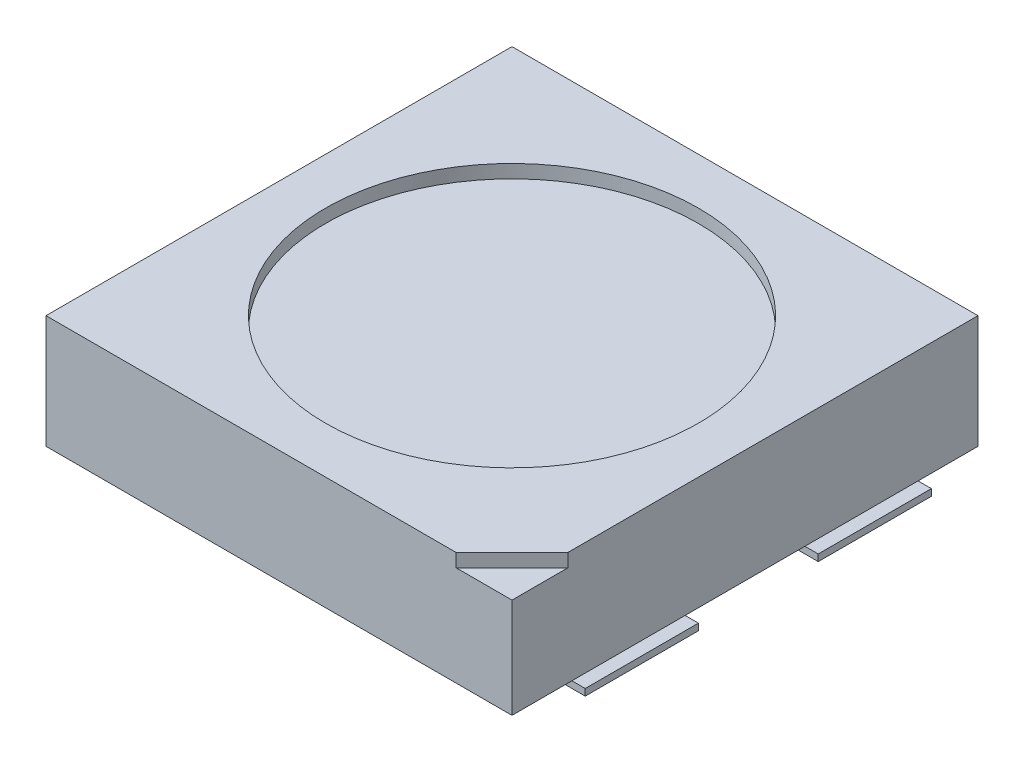
ISO-10303-21;
HEADER;
FILE_DESCRIPTION(('STEP AP214'),'2;1');
FILE_NAME('part.step','',(''),(''),'','','');
FILE_SCHEMA(('AUTOMOTIVE_DESIGN { 1 0 10303 214 1 1 1 1 }'));
ENDSEC;
DATA;
#1=APPLICATION_CONTEXT('core data for automotive mechanical design processes');
#2=APPLICATION_PROTOCOL_DEFINITION('international standard','automotive_design',2000,#1);
#3=PRODUCT_CONTEXT('',#1,'mechanical');
#4=PRODUCT('Part','Part','',(#3));
#5=PRODUCT_RELATED_PRODUCT_CATEGORY('part','',(#4));
#6=PRODUCT_DEFINITION_FORMATION('','',#4);
#7=PRODUCT_DEFINITION_CONTEXT('part definition',#1,'design');
#8=PRODUCT_DEFINITION('design','',#6,#7);
#9=PRODUCT_DEFINITION_SHAPE('','',#8);
#10=(LENGTH_UNIT() NAMED_UNIT(*) SI_UNIT(.MILLI.,.METRE.));
#11=(NAMED_UNIT(*) PLANE_ANGLE_UNIT() SI_UNIT($,.RADIAN.));
#12=(NAMED_UNIT(*) SI_UNIT($,.STERADIAN.) SOLID_ANGLE_UNIT());
#13=UNCERTAINTY_MEASURE_WITH_UNIT(LENGTH_MEASURE(1.E-05),#10,'distance_accuracy_value','');
#14=(GEOMETRIC_REPRESENTATION_CONTEXT(3) GLOBAL_UNCERTAINTY_ASSIGNED_CONTEXT((#13)) GLOBAL_UNIT_ASSIGNED_CONTEXT((#10,
#11,#12)) REPRESENTATION_CONTEXT('',''));
#15=CARTESIAN_POINT('',(0.,0.,0.));
#16=DIRECTION('',(0.,0.,1.));
#17=DIRECTION('',(1.,0.,0.));
#18=AXIS2_PLACEMENT_3D('',#15,#16,#17);
#19=CARTESIAN_POINT('',(0.,-0.05,0.));
#20=DIRECTION('',(0.,1.,0.));
#21=DIRECTION('',(0.,0.,1.));
#22=AXIS2_PLACEMENT_3D('',#19,#20,#21);
#23=PLANE('',#22);
#24=DIRECTION('',(0.,0.,1.));
#25=VECTOR('',#24,1.);
#26=CARTESIAN_POINT('',(-1.75,-0.05,0.));
#27=LINE('',#26,#25);
#28=CARTESIAN_POINT('',(-1.75,-0.05,0.45));
#29=VERTEX_POINT('',#28);
#30=CARTESIAN_POINT('',(-1.75,-0.05,1.3));
#31=VERTEX_POINT('',#30);
#32=EDGE_CURVE('E302',#29,#31,#27,.T.);
#33=ORIENTED_EDGE('',*,*,#32,.F.);
#34=DIRECTION('',(1.,0.,0.));
#35=VECTOR('',#34,1.);
#36=CARTESIAN_POINT('',(0.,-0.05,0.45));
#37=LINE('',#36,#35);
#38=CARTESIAN_POINT('',(-0.576813243409901,-0.05,0.450000000000079));
#39=VERTEX_POINT('',#38);
#40=EDGE_CURVE('E293',#39,#29,#37,.F.);
#41=ORIENTED_EDGE('',*,*,#40,.F.);
#42=DIRECTION('',(-0.626987774724974,0.,0.779029094671968));
#43=VECTOR('',#42,1.);
#44=CARTESIAN_POINT('',(-0.130261299256,-0.05,-0.104838500528));
#45=LINE('',#44,#43);
#46=CARTESIAN_POINT('',(-0.414919619925883,-0.05,0.248848003071094));
#47=VERTEX_POINT('',#46);
#48=EDGE_CURVE('E286',#47,#39,#45,.T.);
#49=ORIENTED_EDGE('',*,*,#48,.F.);
#50=DIRECTION('',(-1.,0.,0.));
#51=VECTOR('',#50,1.);
#52=CARTESIAN_POINT('',(0.,-0.05,0.248848003071));
#53=LINE('',#52,#51);
#54=CARTESIAN_POINT('',(0.45,-0.05,0.248848003071));
#55=VERTEX_POINT('',#54);
#56=EDGE_CURVE('E334',#55,#47,#53,.T.);
#57=ORIENTED_EDGE('',*,*,#56,.F.);
#58=DIRECTION('',(0.,0.,-1.));
#59=VECTOR('',#58,1.);
#60=CARTESIAN_POINT('',(0.45,-0.05,0.));
#61=LINE('',#60,#59);
#62=CARTESIAN_POINT('',(0.45,-0.05,1.3));
#63=VERTEX_POINT('',#62);
#64=EDGE_CURVE('E342',#63,#55,#61,.T.);
#65=ORIENTED_EDGE('',*,*,#64,.F.);
#66=DIRECTION('',(1.,0.,0.));
#67=VECTOR('',#66,1.);
#68=CARTESIAN_POINT('',(0.,-0.05,1.3));
#69=LINE('',#68,#67);
#70=EDGE_CURVE('E313',#31,#63,#69,.T.);
#71=ORIENTED_EDGE('',*,*,#70,.F.);
#72=EDGE_LOOP('',(#33,#41,#49,#57,#65,#71));
#73=FACE_BOUND('',#72,.T.);
#74=ADVANCED_FACE('F17',(#73),#23,.F.);
#75=CARTESIAN_POINT('',(0.,-0.05,0.));
#76=DIRECTION('',(0.,1.,0.));
#77=DIRECTION('',(0.,0.,1.));
#78=AXIS2_PLACEMENT_3D('',#75,#76,#77);
#79=PLANE('',#78);
#80=DIRECTION('',(0.,0.,-1.));
#81=VECTOR('',#80,1.);
#82=CARTESIAN_POINT('',(1.85,-0.05,0.));
#83=LINE('',#82,#81);
#84=CARTESIAN_POINT('',(1.85,-0.05,1.3));
#85=VERTEX_POINT('',#84);
#86=CARTESIAN_POINT('',(1.85,-0.05,0.45));
#87=VERTEX_POINT('',#86);
#88=EDGE_CURVE('E323',#85,#87,#83,.T.);
#89=ORIENTED_EDGE('',*,*,#88,.F.);
#90=DIRECTION('',(1.,0.,0.));
#91=VECTOR('',#90,1.);
#92=CARTESIAN_POINT('',(0.,-0.05,1.3));
#93=LINE('',#92,#91);
#94=CARTESIAN_POINT('',(0.85,-0.05,1.3));
#95=VERTEX_POINT('',#94);
#96=EDGE_CURVE('E359',#95,#85,#93,.T.);
#97=ORIENTED_EDGE('',*,*,#96,.F.);
#98=DIRECTION('',(0.,0.,1.));
#99=VECTOR('',#98,1.);
#100=CARTESIAN_POINT('',(0.85,-0.05,0.));
#101=LINE('',#100,#99);
#102=CARTESIAN_POINT('',(0.85,-0.05,0.45));
#103=VERTEX_POINT('',#102);
#104=EDGE_CURVE('E366',#103,#95,#101,.T.);
#105=ORIENTED_EDGE('',*,*,#104,.F.);
#106=DIRECTION('',(1.,0.,0.));
#107=VECTOR('',#106,1.);
#108=CARTESIAN_POINT('',(0.,-0.05,0.45));
#109=LINE('',#108,#107);
#110=EDGE_CURVE('E378',#103,#87,#109,.T.);
#111=ORIENTED_EDGE('',*,*,#110,.T.);
#112=EDGE_LOOP('',(#89,#97,#105,#111));
#113=FACE_BOUND('',#112,.T.);
#114=ADVANCED_FACE('F801',(#113),#79,.F.);
#115=CARTESIAN_POINT('',(0.,-0.05,0.));
#116=DIRECTION('',(0.,1.,0.));
#117=DIRECTION('',(0.,0.,1.));
#118=AXIS2_PLACEMENT_3D('',#115,#116,#117);
#119=PLANE('',#118);
#120=DIRECTION('',(1.,0.,0.));
#121=VECTOR('',#120,1.);
#122=CARTESIAN_POINT('',(0.,-0.05,-1.3));
#123=LINE('',#122,#121);
#124=CARTESIAN_POINT('',(-0.225885680322,-0.05,-1.3));
#125=VERTEX_POINT('',#124);
#126=CARTESIAN_POINT('',(1.85,-0.05,-1.3));
#127=VERTEX_POINT('',#126);
#128=EDGE_CURVE('E416',#125,#127,#123,.T.);
#129=ORIENTED_EDGE('',*,*,#128,.T.);
#130=DIRECTION('',(0.,0.,-1.));
#131=VECTOR('',#130,1.);
#132=CARTESIAN_POINT('',(1.85,-0.05,0.));
#133=LINE('',#132,#131);
#134=CARTESIAN_POINT('',(1.85,-0.05,-0.45));
#135=VERTEX_POINT('',#134);
#136=EDGE_CURVE('E316',#135,#127,#133,.T.);
#137=ORIENTED_EDGE('',*,*,#136,.F.);
#138=DIRECTION('',(1.,0.,0.));
#139=VECTOR('',#138,1.);
#140=CARTESIAN_POINT('',(0.,-0.05,-0.45));
#141=LINE('',#140,#139);
#142=CARTESIAN_POINT('',(1.35,-0.05,-0.45));
#143=VERTEX_POINT('',#142);
#144=EDGE_CURVE('E384',#143,#135,#141,.T.);
#145=ORIENTED_EDGE('',*,*,#144,.F.);
#146=DIRECTION('',(0.,0.,1.));
#147=VECTOR('',#146,1.);
#148=CARTESIAN_POINT('',(1.35,-0.05,0.));
#149=LINE('',#148,#147);
#150=CARTESIAN_POINT('',(1.35,-0.05,-0.05));
#151=VERTEX_POINT('',#150);
#152=EDGE_CURVE('E395',#143,#151,#149,.T.);
#153=ORIENTED_EDGE('',*,*,#152,.T.);
#154=DIRECTION('',(-1.,0.,0.));
#155=VECTOR('',#154,1.);
#156=CARTESIAN_POINT('',(0.,-0.05,-0.05));
#157=LINE('',#156,#155);
#158=CARTESIAN_POINT('',(-0.225885680322,-0.05,-0.05));
#159=VERTEX_POINT('',#158);
#160=EDGE_CURVE('E402',#151,#159,#157,.T.);
#161=ORIENTED_EDGE('',*,*,#160,.T.);
#162=DIRECTION('',(0.,0.,-1.));
#163=VECTOR('',#162,1.);
#164=CARTESIAN_POINT('',(-0.225885680322,-0.05,0.));
#165=LINE('',#164,#163);
#166=EDGE_CURVE('E409',#159,#125,#165,.T.);
#167=ORIENTED_EDGE('',*,*,#166,.T.);
#168=EDGE_LOOP('',(#129,#137,#145,#153,#161,#167));
#169=FACE_BOUND('',#168,.T.);
#170=ADVANCED_FACE('F798',(#169),#119,.F.);
#171=CARTESIAN_POINT('',(0.,-0.05,0.));
#172=DIRECTION('',(0.,1.,0.));
#173=DIRECTION('',(0.,0.,1.));
#174=AXIS2_PLACEMENT_3D('',#171,#172,#173);
#175=PLANE('',#174);
#176=DIRECTION('',(-1.,0.,0.));
#177=VECTOR('',#176,1.);
#178=CARTESIAN_POINT('',(0.,-0.05,0.180008566968));
#179=LINE('',#178,#177);
#180=CARTESIAN_POINT('',(-0.811004003318407,-0.05,0.180008566967672));
#181=VERTEX_POINT('',#180);
#182=CARTESIAN_POINT('',(-1.45,-0.05,0.180008566968));
#183=VERTEX_POINT('',#182);
#184=EDGE_CURVE('E447',#181,#183,#179,.T.);
#185=ORIENTED_EDGE('',*,*,#184,.T.);
#186=DIRECTION('',(0.,0.,-1.));
#187=VECTOR('',#186,1.);
#188=CARTESIAN_POINT('',(-1.45,-0.05,0.));
#189=LINE('',#188,#187);
#190=CARTESIAN_POINT('',(-1.45,-0.05,-0.45));
#191=VERTEX_POINT('',#190);
#192=EDGE_CURVE('E454',#183,#191,#189,.T.);
#193=ORIENTED_EDGE('',*,*,#192,.T.);
#194=DIRECTION('',(1.,0.,0.));
#195=VECTOR('',#194,1.);
#196=CARTESIAN_POINT('',(0.,-0.05,-0.45));
#197=LINE('',#196,#195);
#198=CARTESIAN_POINT('',(-1.85,-0.05,-0.45));
#199=VERTEX_POINT('',#198);
#200=EDGE_CURVE('E460',#199,#191,#197,.T.);
#201=ORIENTED_EDGE('',*,*,#200,.F.);
#202=DIRECTION('',(0.,0.,-1.));
#203=VECTOR('',#202,1.);
#204=CARTESIAN_POINT('',(-1.85,-0.05,0.));
#205=LINE('',#204,#203);
#206=CARTESIAN_POINT('',(-1.85,-0.05,-1.3));
#207=VERTEX_POINT('',#206);
#208=EDGE_CURVE('E329',#199,#207,#205,.T.);
#209=ORIENTED_EDGE('',*,*,#208,.T.);
#210=DIRECTION('',(1.,0.,0.));
#211=VECTOR('',#210,1.);
#212=CARTESIAN_POINT('',(0.,-0.05,-1.3));
#213=LINE('',#212,#211);
#214=CARTESIAN_POINT('',(-0.625885680322,-0.05,-1.3));
#215=VERTEX_POINT('',#214);
#216=EDGE_CURVE('E426',#207,#215,#213,.T.);
#217=ORIENTED_EDGE('',*,*,#216,.T.);
#218=DIRECTION('',(0.,0.,1.));
#219=VECTOR('',#218,1.);
#220=CARTESIAN_POINT('',(-0.625885680322,-0.05,0.));
#221=LINE('',#220,#219);
#222=CARTESIAN_POINT('',(-0.625885680322169,-0.05,-0.0500000000001356));
#223=VERTEX_POINT('',#222);
#224=EDGE_CURVE('E433',#215,#223,#221,.T.);
#225=ORIENTED_EDGE('',*,*,#224,.T.);
#226=DIRECTION('',(-0.626987774724974,0.,0.779029094671968));
#227=VECTOR('',#226,1.);
#228=CARTESIAN_POINT('',(-0.404263549673,-0.05,-0.325364360773));
#229=LINE('',#228,#227);
#230=EDGE_CURVE('E440',#223,#181,#229,.T.);
#231=ORIENTED_EDGE('',*,*,#230,.T.);
#232=EDGE_LOOP('',(#185,#193,#201,#209,#217,#225,#231));
#233=FACE_BOUND('',#232,.T.);
#234=ADVANCED_FACE('F794',(#233),#175,.F.);
#235=CARTESIAN_POINT('',(1.85,-0.05,0.));
#236=DIRECTION('',(1.,0.,0.));
#237=DIRECTION('',(0.,0.,-1.));
#238=AXIS2_PLACEMENT_3D('',#235,#236,#237);
#239=PLANE('',#238);
#240=ORIENTED_EDGE('',*,*,#136,.T.);
#241=DIRECTION('',(0.,1.,0.));
#242=VECTOR('',#241,1.);
#243=CARTESIAN_POINT('',(1.85,-0.05,-1.3));
#244=LINE('',#243,#242);
#245=CARTESIAN_POINT('',(1.85,0.,-1.3));
#246=VERTEX_POINT('',#245);
#247=EDGE_CURVE('E419',#127,#246,#244,.T.);
#248=ORIENTED_EDGE('',*,*,#247,.T.);
#249=DIRECTION('',(0.,0.,1.));
#250=VECTOR('',#249,1.);
#251=CARTESIAN_POINT('',(1.85,0.,0.));
#252=LINE('',#251,#250);
#253=CARTESIAN_POINT('',(1.85,0.,-0.45));
#254=VERTEX_POINT('',#253);
#255=EDGE_CURVE('E472',#254,#246,#252,.F.);
#256=ORIENTED_EDGE('',*,*,#255,.F.);
#257=DIRECTION('',(0.,1.,0.));
#258=VECTOR('',#257,1.);
#259=CARTESIAN_POINT('',(1.85,-0.05,-0.45));
#260=LINE('',#259,#258);
#261=EDGE_CURVE('E388',#135,#254,#260,.T.);
#262=ORIENTED_EDGE('',*,*,#261,.F.);
#263=EDGE_LOOP('',(#240,#248,#256,#262));
#264=FACE_BOUND('',#263,.T.);
#265=ADVANCED_FACE('F790',(#264),#239,.T.);
#266=CARTESIAN_POINT('',(1.85,-0.05,0.));
#267=DIRECTION('',(1.,0.,0.));
#268=DIRECTION('',(0.,0.,-1.));
#269=AXIS2_PLACEMENT_3D('',#266,#267,#268);
#270=PLANE('',#269);
#271=ORIENTED_EDGE('',*,*,#88,.T.);
#272=DIRECTION('',(0.,1.,0.));
#273=VECTOR('',#272,1.);
#274=CARTESIAN_POINT('',(1.85,-0.05,0.45));
#275=LINE('',#274,#273);
#276=CARTESIAN_POINT('',(1.85,0.,0.45));
#277=VERTEX_POINT('',#276);
#278=EDGE_CURVE('E381',#87,#277,#275,.T.);
#279=ORIENTED_EDGE('',*,*,#278,.T.);
#280=DIRECTION('',(0.,0.,1.));
#281=VECTOR('',#280,1.);
#282=CARTESIAN_POINT('',(1.85,0.,0.));
#283=LINE('',#282,#281);
#284=CARTESIAN_POINT('',(1.85,0.,1.3));
#285=VERTEX_POINT('',#284);
#286=EDGE_CURVE('E484',#285,#277,#283,.F.);
#287=ORIENTED_EDGE('',*,*,#286,.F.);
#288=DIRECTION('',(0.,1.,0.));
#289=VECTOR('',#288,1.);
#290=CARTESIAN_POINT('',(1.85,-0.05,1.3));
#291=LINE('',#290,#289);
#292=EDGE_CURVE('E363',#85,#285,#291,.T.);
#293=ORIENTED_EDGE('',*,*,#292,.F.);
#294=EDGE_LOOP('',(#271,#279,#287,#293));
#295=FACE_BOUND('',#294,.T.);
#296=ADVANCED_FACE('F786',(#295),#270,.T.);
#297=CARTESIAN_POINT('',(-1.85,-0.05,0.));
#298=DIRECTION('',(1.,0.,0.));
#299=DIRECTION('',(0.,0.,-1.));
#300=AXIS2_PLACEMENT_3D('',#297,#298,#299);
#301=PLANE('',#300);
#302=DIRECTION('',(0.,1.,0.));
#303=VECTOR('',#302,1.);
#304=CARTESIAN_POINT('',(-1.85,-0.05,-1.3));
#305=LINE('',#304,#303);
#306=CARTESIAN_POINT('',(-1.85,0.,-1.3));
#307=VERTEX_POINT('',#306);
#308=EDGE_CURVE('E422',#307,#207,#305,.F.);
#309=ORIENTED_EDGE('',*,*,#308,.T.);
#310=ORIENTED_EDGE('',*,*,#208,.F.);
#311=DIRECTION('',(0.,1.,0.));
#312=VECTOR('',#311,1.);
#313=CARTESIAN_POINT('',(-1.85,-0.05,-0.45));
#314=LINE('',#313,#312);
#315=CARTESIAN_POINT('',(-1.85,0.,-0.45));
#316=VERTEX_POINT('',#315);
#317=EDGE_CURVE('E457',#316,#199,#314,.F.);
#318=ORIENTED_EDGE('',*,*,#317,.F.);
#319=DIRECTION('',(0.,0.,1.));
#320=VECTOR('',#319,1.);
#321=CARTESIAN_POINT('',(-1.85,0.,0.));
#322=LINE('',#321,#320);
#323=EDGE_CURVE('E500',#307,#316,#322,.T.);
#324=ORIENTED_EDGE('',*,*,#323,.F.);
#325=EDGE_LOOP('',(#309,#310,#318,#324));
#326=FACE_BOUND('',#325,.T.);
#327=ADVANCED_FACE('F782',(#326),#301,.F.);
#328=CARTESIAN_POINT('',(-0.130261299256,-0.05,-0.104838500528));
#329=DIRECTION('',(-0.779029094671968,0.,-0.626987774724974));
#330=DIRECTION('',(-0.626987774724974,0.,0.779029094671968));
#331=AXIS2_PLACEMENT_3D('',#328,#329,#330);
#332=PLANE('',#331);
#333=ORIENTED_EDGE('',*,*,#48,.T.);
#334=DIRECTION('',(0.,1.,0.));
#335=VECTOR('',#334,1.);
#336=CARTESIAN_POINT('',(-0.57681324341,-0.05,0.45));
#337=LINE('',#336,#335);
#338=CARTESIAN_POINT('',(-0.576813243409901,0.,0.450000000000079));
#339=VERTEX_POINT('',#338);
#340=EDGE_CURVE('E299',#39,#339,#337,.T.);
#341=ORIENTED_EDGE('',*,*,#340,.T.);
#342=DIRECTION('',(0.626987774724691,0.,-0.779029094672195));
#343=VECTOR('',#342,1.);
#344=CARTESIAN_POINT('',(-0.57681324341,0.,0.45));
#345=LINE('',#344,#343);
#346=CARTESIAN_POINT('',(-0.414919619925767,0.,0.248848003071188));
#347=VERTEX_POINT('',#346);
#348=EDGE_CURVE('E509',#339,#347,#345,.T.);
#349=ORIENTED_EDGE('',*,*,#348,.T.);
#350=DIRECTION('',(0.,1.,0.));
#351=VECTOR('',#350,1.);
#352=CARTESIAN_POINT('',(-0.414919619926,-0.05,0.248848003071));
#353=LINE('',#352,#351);
#354=EDGE_CURVE('E338',#47,#347,#353,.T.);
#355=ORIENTED_EDGE('',*,*,#354,.F.);
#356=EDGE_LOOP('',(#333,#341,#349,#355));
#357=FACE_BOUND('',#356,.T.);
#358=ADVANCED_FACE('F778',(#357),#332,.T.);
#359=CARTESIAN_POINT('',(0.,-0.05,0.248848003071));
#360=DIRECTION('',(0.,0.,-1.));
#361=DIRECTION('',(-1.,0.,0.));
#362=AXIS2_PLACEMENT_3D('',#359,#360,#361);
#363=PLANE('',#362);
#364=ORIENTED_EDGE('',*,*,#56,.T.);
#365=ORIENTED_EDGE('',*,*,#354,.T.);
#366=DIRECTION('',(1.,0.,0.));
#367=VECTOR('',#366,1.);
#368=CARTESIAN_POINT('',(0.,0.,0.248848003071));
#369=LINE('',#368,#367);
#370=CARTESIAN_POINT('',(0.45,0.,0.248848003071));
#371=VERTEX_POINT('',#370);
#372=EDGE_CURVE('E512',#347,#371,#369,.T.);
#373=ORIENTED_EDGE('',*,*,#372,.T.);
#374=DIRECTION('',(0.,1.,0.));
#375=VECTOR('',#374,1.);
#376=CARTESIAN_POINT('',(0.45,-0.05,0.248848003071));
#377=LINE('',#376,#375);
#378=EDGE_CURVE('E346',#55,#371,#377,.T.);
#379=ORIENTED_EDGE('',*,*,#378,.F.);
#380=EDGE_LOOP('',(#364,#365,#373,#379));
#381=FACE_BOUND('',#380,.T.);
#382=ADVANCED_FACE('F774',(#381),#363,.T.);
#383=CARTESIAN_POINT('',(0.45,-0.05,0.));
#384=DIRECTION('',(1.,0.,0.));
#385=DIRECTION('',(0.,0.,-1.));
#386=AXIS2_PLACEMENT_3D('',#383,#384,#385);
#387=PLANE('',#386);
#388=ORIENTED_EDGE('',*,*,#64,.T.);
#389=ORIENTED_EDGE('',*,*,#378,.T.);
#390=DIRECTION('',(0.,0.,1.));
#391=VECTOR('',#390,1.);
#392=CARTESIAN_POINT('',(0.45,0.,0.));
#393=LINE('',#392,#391);
#394=CARTESIAN_POINT('',(0.45,0.,1.3));
#395=VERTEX_POINT('',#394);
#396=EDGE_CURVE('E515',#371,#395,#393,.T.);
#397=ORIENTED_EDGE('',*,*,#396,.T.);
#398=DIRECTION('',(0.,1.,0.));
#399=VECTOR('',#398,1.);
#400=CARTESIAN_POINT('',(0.45,-0.05,1.3));
#401=LINE('',#400,#399);
#402=EDGE_CURVE('E355',#63,#395,#401,.T.);
#403=ORIENTED_EDGE('',*,*,#402,.F.);
#404=EDGE_LOOP('',(#388,#389,#397,#403));
#405=FACE_BOUND('',#404,.T.);
#406=ADVANCED_FACE('F770',(#405),#387,.T.);
#407=CARTESIAN_POINT('',(0.,-0.05,1.3));
#408=DIRECTION('',(0.,0.,1.));
#409=DIRECTION('',(1.,0.,0.));
#410=AXIS2_PLACEMENT_3D('',#407,#408,#409);
#411=PLANE('',#410);
#412=ORIENTED_EDGE('',*,*,#70,.T.);
#413=ORIENTED_EDGE('',*,*,#402,.T.);
#414=DIRECTION('',(1.,0.,0.));
#415=VECTOR('',#414,1.);
#416=CARTESIAN_POINT('',(0.,0.,1.3));
#417=LINE('',#416,#415);
#418=CARTESIAN_POINT('',(-1.75,0.,1.3));
#419=VERTEX_POINT('',#418);
#420=EDGE_CURVE('E518',#395,#419,#417,.F.);
#421=ORIENTED_EDGE('',*,*,#420,.T.);
#422=DIRECTION('',(0.,1.,0.));
#423=VECTOR('',#422,1.);
#424=CARTESIAN_POINT('',(-1.75,-0.05,1.3));
#425=LINE('',#424,#423);
#426=EDGE_CURVE('E350',#419,#31,#425,.F.);
#427=ORIENTED_EDGE('',*,*,#426,.T.);
#428=EDGE_LOOP('',(#412,#413,#421,#427));
#429=FACE_BOUND('',#428,.T.);
#430=ADVANCED_FACE('F766',(#429),#411,.T.);
#431=CARTESIAN_POINT('',(0.,-0.05,1.3));
#432=DIRECTION('',(0.,0.,1.));
#433=DIRECTION('',(1.,0.,0.));
#434=AXIS2_PLACEMENT_3D('',#431,#432,#433);
#435=PLANE('',#434);
#436=ORIENTED_EDGE('',*,*,#292,.T.);
#437=DIRECTION('',(1.,0.,0.));
#438=VECTOR('',#437,1.);
#439=CARTESIAN_POINT('',(0.,0.,1.3));
#440=LINE('',#439,#438);
#441=CARTESIAN_POINT('',(1.75,0.,1.3));
#442=VERTEX_POINT('',#441);
#443=EDGE_CURVE('E480',#442,#285,#440,.T.);
#444=ORIENTED_EDGE('',*,*,#443,.F.);
#445=DIRECTION('',(1.,0.,0.));
#446=VECTOR('',#445,1.);
#447=CARTESIAN_POINT('',(0.,0.,1.3));
#448=LINE('',#447,#446);
#449=CARTESIAN_POINT('',(0.85,0.,1.3));
#450=VERTEX_POINT('',#449);
#451=EDGE_CURVE('E521',#442,#450,#448,.F.);
#452=ORIENTED_EDGE('',*,*,#451,.T.);
#453=DIRECTION('',(0.,1.,0.));
#454=VECTOR('',#453,1.);
#455=CARTESIAN_POINT('',(0.85,-0.05,1.3));
#456=LINE('',#455,#454);
#457=EDGE_CURVE('E370',#95,#450,#456,.T.);
#458=ORIENTED_EDGE('',*,*,#457,.F.);
#459=ORIENTED_EDGE('',*,*,#96,.T.);
#460=EDGE_LOOP('',(#436,#444,#452,#458,#459));
#461=FACE_BOUND('',#460,.T.);
#462=ADVANCED_FACE('F762',(#461),#435,.T.);
#463=CARTESIAN_POINT('',(0.85,-0.05,0.));
#464=DIRECTION('',(-1.,0.,0.));
#465=DIRECTION('',(0.,0.,1.));
#466=AXIS2_PLACEMENT_3D('',#463,#464,#465);
#467=PLANE('',#466);
#468=ORIENTED_EDGE('',*,*,#104,.T.);
#469=ORIENTED_EDGE('',*,*,#457,.T.);
#470=DIRECTION('',(0.,0.,1.));
#471=VECTOR('',#470,1.);
#472=CARTESIAN_POINT('',(0.85,0.,0.));
#473=LINE('',#472,#471);
#474=CARTESIAN_POINT('',(0.85,0.,0.45));
#475=VERTEX_POINT('',#474);
#476=EDGE_CURVE('E524',#450,#475,#473,.F.);
#477=ORIENTED_EDGE('',*,*,#476,.T.);
#478=DIRECTION('',(0.,1.,0.));
#479=VECTOR('',#478,1.);
#480=CARTESIAN_POINT('',(0.85,-0.05,0.45));
#481=LINE('',#480,#479);
#482=EDGE_CURVE('E374',#475,#103,#481,.F.);
#483=ORIENTED_EDGE('',*,*,#482,.T.);
#484=EDGE_LOOP('',(#468,#469,#477,#483));
#485=FACE_BOUND('',#484,.T.);
#486=ADVANCED_FACE('F758',(#485),#467,.T.);
#487=CARTESIAN_POINT('',(0.,-0.05,0.45));
#488=DIRECTION('',(0.,0.,1.));
#489=DIRECTION('',(1.,0.,0.));
#490=AXIS2_PLACEMENT_3D('',#487,#488,#489);
#491=PLANE('',#490);
#492=DIRECTION('',(1.,0.,0.));
#493=VECTOR('',#492,1.);
#494=CARTESIAN_POINT('',(0.,0.,0.45));
#495=LINE('',#494,#493);
#496=CARTESIAN_POINT('',(1.75,0.,0.45));
#497=VERTEX_POINT('',#496);
#498=EDGE_CURVE('E488',#277,#497,#495,.F.);
#499=ORIENTED_EDGE('',*,*,#498,.F.);
#500=ORIENTED_EDGE('',*,*,#278,.F.);
#501=ORIENTED_EDGE('',*,*,#110,.F.);
#502=ORIENTED_EDGE('',*,*,#482,.F.);
#503=DIRECTION('',(1.,0.,0.));
#504=VECTOR('',#503,1.);
#505=CARTESIAN_POINT('',(0.,0.,0.45));
#506=LINE('',#505,#504);
#507=EDGE_CURVE('E527',#475,#497,#506,.T.);
#508=ORIENTED_EDGE('',*,*,#507,.T.);
#509=EDGE_LOOP('',(#499,#500,#501,#502,#508));
#510=FACE_BOUND('',#509,.T.);
#511=ADVANCED_FACE('F754',(#510),#491,.F.);
#512=CARTESIAN_POINT('',(0.,-0.05,-0.45));
#513=DIRECTION('',(0.,0.,1.));
#514=DIRECTION('',(1.,0.,0.));
#515=AXIS2_PLACEMENT_3D('',#512,#513,#514);
#516=PLANE('',#515);
#517=ORIENTED_EDGE('',*,*,#261,.T.);
#518=DIRECTION('',(1.,0.,0.));
#519=VECTOR('',#518,1.);
#520=CARTESIAN_POINT('',(0.,0.,-0.45));
#521=LINE('',#520,#519);
#522=CARTESIAN_POINT('',(1.75,0.,-0.45));
#523=VERTEX_POINT('',#522);
#524=EDGE_CURVE('E468',#523,#254,#521,.T.);
#525=ORIENTED_EDGE('',*,*,#524,.F.);
#526=DIRECTION('',(1.,0.,0.));
#527=VECTOR('',#526,1.);
#528=CARTESIAN_POINT('',(0.,0.,-0.45));
#529=LINE('',#528,#527);
#530=CARTESIAN_POINT('',(1.35,0.,-0.45));
#531=VERTEX_POINT('',#530);
#532=EDGE_CURVE('E530',#523,#531,#529,.F.);
#533=ORIENTED_EDGE('',*,*,#532,.T.);
#534=DIRECTION('',(0.,1.,0.));
#535=VECTOR('',#534,1.);
#536=CARTESIAN_POINT('',(1.35,-0.05,-0.45));
#537=LINE('',#536,#535);
#538=EDGE_CURVE('E391',#531,#143,#537,.F.);
#539=ORIENTED_EDGE('',*,*,#538,.T.);
#540=ORIENTED_EDGE('',*,*,#144,.T.);
#541=EDGE_LOOP('',(#517,#525,#533,#539,#540));
#542=FACE_BOUND('',#541,.T.);
#543=ADVANCED_FACE('F750',(#542),#516,.T.);
#544=CARTESIAN_POINT('',(1.35,-0.05,0.));
#545=DIRECTION('',(-1.,0.,0.));
#546=DIRECTION('',(0.,0.,1.));
#547=AXIS2_PLACEMENT_3D('',#544,#545,#546);
#548=PLANE('',#547);
#549=DIRECTION('',(0.,1.,0.));
#550=VECTOR('',#549,1.);
#551=CARTESIAN_POINT('',(1.35,-0.05,-0.0500000000000002));
#552=LINE('',#551,#550);
#553=CARTESIAN_POINT('',(1.35,0.,-0.05));
#554=VERTEX_POINT('',#553);
#555=EDGE_CURVE('E398',#554,#151,#552,.F.);
#556=ORIENTED_EDGE('',*,*,#555,.T.);
#557=ORIENTED_EDGE('',*,*,#152,.F.);
#558=ORIENTED_EDGE('',*,*,#538,.F.);
#559=DIRECTION('',(0.,0.,1.));
#560=VECTOR('',#559,1.);
#561=CARTESIAN_POINT('',(1.35,0.,0.));
#562=LINE('',#561,#560);
#563=EDGE_CURVE('E533',#531,#554,#562,.T.);
#564=ORIENTED_EDGE('',*,*,#563,.T.);
#565=EDGE_LOOP('',(#556,#557,#558,#564));
#566=FACE_BOUND('',#565,.T.);
#567=ADVANCED_FACE('F746',(#566),#548,.F.);
#568=CARTESIAN_POINT('',(0.,-0.05,-0.05));
#569=DIRECTION('',(0.,0.,-1.));
#570=DIRECTION('',(-1.,0.,0.));
#571=AXIS2_PLACEMENT_3D('',#568,#569,#570);
#572=PLANE('',#571);
#573=DIRECTION('',(0.,1.,0.));
#574=VECTOR('',#573,1.);
#575=CARTESIAN_POINT('',(-0.225885680322,-0.05,-0.05));
#576=LINE('',#575,#574);
#577=CARTESIAN_POINT('',(-0.225885680322,0.,-0.05));
#578=VERTEX_POINT('',#577);
#579=EDGE_CURVE('E405',#578,#159,#576,.F.);
#580=ORIENTED_EDGE('',*,*,#579,.T.);
#581=ORIENTED_EDGE('',*,*,#160,.F.);
#582=ORIENTED_EDGE('',*,*,#555,.F.);
#583=DIRECTION('',(1.,0.,0.));
#584=VECTOR('',#583,1.);
#585=CARTESIAN_POINT('',(0.,0.,-0.05));
#586=LINE('',#585,#584);
#587=EDGE_CURVE('E536',#554,#578,#586,.F.);
#588=ORIENTED_EDGE('',*,*,#587,.T.);
#589=EDGE_LOOP('',(#580,#581,#582,#588));
#590=FACE_BOUND('',#589,.T.);
#591=ADVANCED_FACE('F742',(#590),#572,.F.);
#592=CARTESIAN_POINT('',(-0.225885680322,-0.05,0.));
#593=DIRECTION('',(1.,0.,0.));
#594=DIRECTION('',(0.,0.,-1.));
#595=AXIS2_PLACEMENT_3D('',#592,#593,#594);
#596=PLANE('',#595);
#597=DIRECTION('',(0.,1.,0.));
#598=VECTOR('',#597,1.);
#599=CARTESIAN_POINT('',(-0.225885680322,-0.05,-1.3));
#600=LINE('',#599,#598);
#601=CARTESIAN_POINT('',(-0.225885680322,0.,-1.3));
#602=VERTEX_POINT('',#601);
#603=EDGE_CURVE('E412',#602,#125,#600,.F.);
#604=ORIENTED_EDGE('',*,*,#603,.T.);
#605=ORIENTED_EDGE('',*,*,#166,.F.);
#606=ORIENTED_EDGE('',*,*,#579,.F.);
#607=DIRECTION('',(0.,0.,1.));
#608=VECTOR('',#607,1.);
#609=CARTESIAN_POINT('',(-0.225885680322,0.,0.));
#610=LINE('',#609,#608);
#611=EDGE_CURVE('E539',#578,#602,#610,.F.);
#612=ORIENTED_EDGE('',*,*,#611,.T.);
#613=EDGE_LOOP('',(#604,#605,#606,#612));
#614=FACE_BOUND('',#613,.T.);
#615=ADVANCED_FACE('F738',(#614),#596,.F.);
#616=CARTESIAN_POINT('',(0.,-0.05,-1.3));
#617=DIRECTION('',(0.,0.,1.));
#618=DIRECTION('',(1.,0.,0.));
#619=AXIS2_PLACEMENT_3D('',#616,#617,#618);
#620=PLANE('',#619);
#621=DIRECTION('',(1.,0.,0.));
#622=VECTOR('',#621,1.);
#623=CARTESIAN_POINT('',(0.,0.,-1.3));
#624=LINE('',#623,#622);
#625=CARTESIAN_POINT('',(1.75,0.,-1.3));
#626=VERTEX_POINT('',#625);
#627=EDGE_CURVE('E476',#246,#626,#624,.F.);
#628=ORIENTED_EDGE('',*,*,#627,.F.);
#629=ORIENTED_EDGE('',*,*,#247,.F.);
#630=ORIENTED_EDGE('',*,*,#128,.F.);
#631=ORIENTED_EDGE('',*,*,#603,.F.);
#632=DIRECTION('',(1.,0.,0.));
#633=VECTOR('',#632,1.);
#634=CARTESIAN_POINT('',(0.,0.,-1.3));
#635=LINE('',#634,#633);
#636=EDGE_CURVE('E542',#602,#626,#635,.T.);
#637=ORIENTED_EDGE('',*,*,#636,.T.);
#638=EDGE_LOOP('',(#628,#629,#630,#631,#637));
#639=FACE_BOUND('',#638,.T.);
#640=ADVANCED_FACE('F734',(#639),#620,.F.);
#641=CARTESIAN_POINT('',(0.,-0.05,-1.3));
#642=DIRECTION('',(0.,0.,1.));
#643=DIRECTION('',(1.,0.,0.));
#644=AXIS2_PLACEMENT_3D('',#641,#642,#643);
#645=PLANE('',#644);
#646=DIRECTION('',(1.,0.,0.));
#647=VECTOR('',#646,1.);
#648=CARTESIAN_POINT('',(0.,0.,-1.3));
#649=LINE('',#648,#647);
#650=CARTESIAN_POINT('',(-1.75,0.,-1.3));
#651=VERTEX_POINT('',#650);
#652=CARTESIAN_POINT('',(-0.625885680322,0.,-1.3));
#653=VERTEX_POINT('',#652);
#654=EDGE_CURVE('E545',#651,#653,#649,.T.);
#655=ORIENTED_EDGE('',*,*,#654,.T.);
#656=DIRECTION('',(0.,1.,0.));
#657=VECTOR('',#656,1.);
#658=CARTESIAN_POINT('',(-0.625885680322,-0.05,-1.3));
#659=LINE('',#658,#657);
#660=EDGE_CURVE('E429',#653,#215,#659,.F.);
#661=ORIENTED_EDGE('',*,*,#660,.T.);
#662=ORIENTED_EDGE('',*,*,#216,.F.);
#663=ORIENTED_EDGE('',*,*,#308,.F.);
#664=DIRECTION('',(1.,0.,0.));
#665=VECTOR('',#664,1.);
#666=CARTESIAN_POINT('',(0.,0.,-1.3));
#667=LINE('',#666,#665);
#668=EDGE_CURVE('E496',#651,#307,#667,.F.);
#669=ORIENTED_EDGE('',*,*,#668,.F.);
#670=EDGE_LOOP('',(#655,#661,#662,#663,#669));
#671=FACE_BOUND('',#670,.T.);
#672=ADVANCED_FACE('F730',(#671),#645,.F.);
#673=CARTESIAN_POINT('',(-0.625885680322,-0.05,0.));
#674=DIRECTION('',(-1.,0.,0.));
#675=DIRECTION('',(0.,0.,1.));
#676=AXIS2_PLACEMENT_3D('',#673,#674,#675);
#677=PLANE('',#676);
#678=DIRECTION('',(0.,1.,0.));
#679=VECTOR('',#678,1.);
#680=CARTESIAN_POINT('',(-0.625885680322674,-0.05,-0.0500000000005425));
#681=LINE('',#680,#679);
#682=CARTESIAN_POINT('',(-0.625885680322169,0.,-0.0500000000001356));
#683=VERTEX_POINT('',#682);
#684=EDGE_CURVE('E436',#683,#223,#681,.F.);
#685=ORIENTED_EDGE('',*,*,#684,.T.);
#686=ORIENTED_EDGE('',*,*,#224,.F.);
#687=ORIENTED_EDGE('',*,*,#660,.F.);
#688=DIRECTION('',(0.,0.,1.));
#689=VECTOR('',#688,1.);
#690=CARTESIAN_POINT('',(-0.625885680322,0.,0.));
#691=LINE('',#690,#689);
#692=EDGE_CURVE('E548',#653,#683,#691,.T.);
#693=ORIENTED_EDGE('',*,*,#692,.T.);
#694=EDGE_LOOP('',(#685,#686,#687,#693));
#695=FACE_BOUND('',#694,.T.);
#696=ADVANCED_FACE('F726',(#695),#677,.F.);
#697=CARTESIAN_POINT('',(-0.404263549673,-0.05,-0.325364360773));
#698=DIRECTION('',(-0.779029094671968,0.,-0.626987774724974));
#699=DIRECTION('',(-0.626987774724974,0.,0.779029094671968));
#700=AXIS2_PLACEMENT_3D('',#697,#698,#699);
#701=PLANE('',#700);
#702=DIRECTION('',(0.,1.,0.));
#703=VECTOR('',#702,1.);
#704=CARTESIAN_POINT('',(-0.811004003318,-0.05,0.180008566968));
#705=LINE('',#704,#703);
#706=CARTESIAN_POINT('',(-0.811004003318407,0.,0.180008566967673));
#707=VERTEX_POINT('',#706);
#708=EDGE_CURVE('E443',#707,#181,#705,.F.);
#709=ORIENTED_EDGE('',*,*,#708,.T.);
#710=ORIENTED_EDGE('',*,*,#230,.F.);
#711=ORIENTED_EDGE('',*,*,#684,.F.);
#712=DIRECTION('',(-0.6269877747245,0.,0.779029094672349));
#713=VECTOR('',#712,1.);
#714=CARTESIAN_POINT('',(-0.625885680322,0.,-0.05));
#715=LINE('',#714,#713);
#716=EDGE_CURVE('E551',#683,#707,#715,.T.);
#717=ORIENTED_EDGE('',*,*,#716,.T.);
#718=EDGE_LOOP('',(#709,#710,#711,#717));
#719=FACE_BOUND('',#718,.T.);
#720=ADVANCED_FACE('F722',(#719),#701,.F.);
#721=CARTESIAN_POINT('',(0.,-0.05,0.180008566968));
#722=DIRECTION('',(0.,0.,-1.));
#723=DIRECTION('',(-1.,0.,0.));
#724=AXIS2_PLACEMENT_3D('',#721,#722,#723);
#725=PLANE('',#724);
#726=DIRECTION('',(0.,1.,0.));
#727=VECTOR('',#726,1.);
#728=CARTESIAN_POINT('',(-1.45,-0.05,0.180008566968));
#729=LINE('',#728,#727);
#730=CARTESIAN_POINT('',(-1.45,0.,0.180008566968));
#731=VERTEX_POINT('',#730);
#732=EDGE_CURVE('E450',#731,#183,#729,.F.);
#733=ORIENTED_EDGE('',*,*,#732,.T.);
#734=ORIENTED_EDGE('',*,*,#184,.F.);
#735=ORIENTED_EDGE('',*,*,#708,.F.);
#736=DIRECTION('',(1.,0.,0.));
#737=VECTOR('',#736,1.);
#738=CARTESIAN_POINT('',(0.,0.,0.180008566968));
#739=LINE('',#738,#737);
#740=EDGE_CURVE('E554',#707,#731,#739,.F.);
#741=ORIENTED_EDGE('',*,*,#740,.T.);
#742=EDGE_LOOP('',(#733,#734,#735,#741));
#743=FACE_BOUND('',#742,.T.);
#744=ADVANCED_FACE('F718',(#743),#725,.F.);
#745=CARTESIAN_POINT('',(-1.45,-0.05,0.));
#746=DIRECTION('',(1.,0.,0.));
#747=DIRECTION('',(0.,0.,-1.));
#748=AXIS2_PLACEMENT_3D('',#745,#746,#747);
#749=PLANE('',#748);
#750=DIRECTION('',(0.,1.,0.));
#751=VECTOR('',#750,1.);
#752=CARTESIAN_POINT('',(-1.45,-0.05,-0.45));
#753=LINE('',#752,#751);
#754=CARTESIAN_POINT('',(-1.45,0.,-0.45));
#755=VERTEX_POINT('',#754);
#756=EDGE_CURVE('E464',#191,#755,#753,.T.);
#757=ORIENTED_EDGE('',*,*,#756,.F.);
#758=ORIENTED_EDGE('',*,*,#192,.F.);
#759=ORIENTED_EDGE('',*,*,#732,.F.);
#760=DIRECTION('',(0.,0.,1.));
#761=VECTOR('',#760,1.);
#762=CARTESIAN_POINT('',(-1.45,0.,0.));
#763=LINE('',#762,#761);
#764=EDGE_CURVE('E557',#731,#755,#763,.F.);
#765=ORIENTED_EDGE('',*,*,#764,.T.);
#766=EDGE_LOOP('',(#757,#758,#759,#765));
#767=FACE_BOUND('',#766,.T.);
#768=ADVANCED_FACE('F714',(#767),#749,.F.);
#769=CARTESIAN_POINT('',(0.,-0.05,-0.45));
#770=DIRECTION('',(0.,0.,1.));
#771=DIRECTION('',(1.,0.,0.));
#772=AXIS2_PLACEMENT_3D('',#769,#770,#771);
#773=PLANE('',#772);
#774=ORIENTED_EDGE('',*,*,#756,.T.);
#775=DIRECTION('',(1.,0.,0.));
#776=VECTOR('',#775,1.);
#777=CARTESIAN_POINT('',(0.,0.,-0.45));
#778=LINE('',#777,#776);
#779=CARTESIAN_POINT('',(-1.75,0.,-0.45));
#780=VERTEX_POINT('',#779);
#781=EDGE_CURVE('E560',#755,#780,#778,.F.);
#782=ORIENTED_EDGE('',*,*,#781,.T.);
#783=DIRECTION('',(1.,0.,0.));
#784=VECTOR('',#783,1.);
#785=CARTESIAN_POINT('',(0.,0.,-0.45));
#786=LINE('',#785,#784);
#787=EDGE_CURVE('E492',#316,#780,#786,.T.);
#788=ORIENTED_EDGE('',*,*,#787,.F.);
#789=ORIENTED_EDGE('',*,*,#317,.T.);
#790=ORIENTED_EDGE('',*,*,#200,.T.);
#791=EDGE_LOOP('',(#774,#782,#788,#789,#790));
#792=FACE_BOUND('',#791,.T.);
#793=ADVANCED_FACE('F710',(#792),#773,.T.);
#794=CARTESIAN_POINT('',(0.,0.,0.));
#795=DIRECTION('',(0.,1.,0.));
#796=DIRECTION('',(0.,0.,1.));
#797=AXIS2_PLACEMENT_3D('',#794,#795,#796);
#798=PLANE('',#797);
#799=ORIENTED_EDGE('',*,*,#255,.T.);
#800=ORIENTED_EDGE('',*,*,#627,.T.);
#801=DIRECTION('',(0.,0.,1.));
#802=VECTOR('',#801,1.);
#803=CARTESIAN_POINT('',(1.75,0.,0.));
#804=LINE('',#803,#802);
#805=EDGE_CURVE('E570',#626,#523,#804,.T.);
#806=ORIENTED_EDGE('',*,*,#805,.T.);
#807=ORIENTED_EDGE('',*,*,#524,.T.);
#808=EDGE_LOOP('',(#799,#800,#806,#807));
#809=FACE_BOUND('',#808,.T.);
#810=ADVANCED_FACE('F706',(#809),#798,.T.);
#811=CARTESIAN_POINT('',(0.,0.,0.));
#812=DIRECTION('',(0.,1.,0.));
#813=DIRECTION('',(0.,0.,1.));
#814=AXIS2_PLACEMENT_3D('',#811,#812,#813);
#815=PLANE('',#814);
#816=ORIENTED_EDGE('',*,*,#286,.T.);
#817=ORIENTED_EDGE('',*,*,#498,.T.);
#818=DIRECTION('',(0.,0.,1.));
#819=VECTOR('',#818,1.);
#820=CARTESIAN_POINT('',(1.75,0.,0.));
#821=LINE('',#820,#819);
#822=EDGE_CURVE('E578',#497,#442,#821,.T.);
#823=ORIENTED_EDGE('',*,*,#822,.T.);
#824=ORIENTED_EDGE('',*,*,#443,.T.);
#825=EDGE_LOOP('',(#816,#817,#823,#824));
#826=FACE_BOUND('',#825,.T.);
#827=ADVANCED_FACE('F702',(#826),#815,.T.);
#828=CARTESIAN_POINT('',(0.,0.,0.));
#829=DIRECTION('',(0.,1.,0.));
#830=DIRECTION('',(0.,0.,1.));
#831=AXIS2_PLACEMENT_3D('',#828,#829,#830);
#832=PLANE('',#831);
#833=ORIENTED_EDGE('',*,*,#668,.T.);
#834=ORIENTED_EDGE('',*,*,#323,.T.);
#835=ORIENTED_EDGE('',*,*,#787,.T.);
#836=DIRECTION('',(0.,0.,1.));
#837=VECTOR('',#836,1.);
#838=CARTESIAN_POINT('',(-1.75,0.,0.));
#839=LINE('',#838,#837);
#840=EDGE_CURVE('E609',#651,#780,#839,.T.);
#841=ORIENTED_EDGE('',*,*,#840,.F.);
#842=EDGE_LOOP('',(#833,#834,#835,#841));
#843=FACE_BOUND('',#842,.T.);
#844=ADVANCED_FACE('F699',(#843),#832,.T.);
#845=CARTESIAN_POINT('',(0.,-0.05,0.45));
#846=DIRECTION('',(0.,0.,1.));
#847=DIRECTION('',(1.,0.,0.));
#848=AXIS2_PLACEMENT_3D('',#845,#846,#847);
#849=PLANE('',#848);
#850=ORIENTED_EDGE('',*,*,#340,.F.);
#851=ORIENTED_EDGE('',*,*,#40,.T.);
#852=DIRECTION('',(0.,1.,0.));
#853=VECTOR('',#852,1.);
#854=CARTESIAN_POINT('',(-1.75,0.85,0.45));
#855=LINE('',#854,#853);
#856=CARTESIAN_POINT('',(-1.75,0.,0.45));
#857=VERTEX_POINT('',#856);
#858=EDGE_CURVE('E297',#857,#29,#855,.F.);
#859=ORIENTED_EDGE('',*,*,#858,.F.);
#860=DIRECTION('',(1.,0.,0.));
#861=VECTOR('',#860,1.);
#862=CARTESIAN_POINT('',(0.,0.,0.45));
#863=LINE('',#862,#861);
#864=EDGE_CURVE('E506',#857,#339,#863,.T.);
#865=ORIENTED_EDGE('',*,*,#864,.T.);
#866=EDGE_LOOP('',(#850,#851,#859,#865));
#867=FACE_BOUND('',#866,.T.);
#868=ADVANCED_FACE('F295',(#867),#849,.F.);
#869=CARTESIAN_POINT('',(0.,0.,0.));
#870=DIRECTION('',(0.,1.,0.));
#871=DIRECTION('',(0.,0.,1.));
#872=AXIS2_PLACEMENT_3D('',#869,#870,#871);
#873=PLANE('',#872);
#874=ORIENTED_EDGE('',*,*,#781,.F.);
#875=ORIENTED_EDGE('',*,*,#764,.F.);
#876=ORIENTED_EDGE('',*,*,#740,.F.);
#877=ORIENTED_EDGE('',*,*,#716,.F.);
#878=ORIENTED_EDGE('',*,*,#692,.F.);
#879=ORIENTED_EDGE('',*,*,#654,.F.);
#880=DIRECTION('',(0.,0.,1.));
#881=VECTOR('',#880,1.);
#882=CARTESIAN_POINT('',(-1.75,0.,0.));
#883=LINE('',#882,#881);
#884=CARTESIAN_POINT('',(-1.75,0.,-1.75));
#885=VERTEX_POINT('',#884);
#886=EDGE_CURVE('E605',#885,#651,#883,.T.);
#887=ORIENTED_EDGE('',*,*,#886,.F.);
#888=DIRECTION('',(-1.,0.,0.));
#889=VECTOR('',#888,1.);
#890=CARTESIAN_POINT('',(0.,0.,-1.75));
#891=LINE('',#890,#889);
#892=CARTESIAN_POINT('',(1.75,0.,-1.75));
#893=VERTEX_POINT('',#892);
#894=EDGE_CURVE('E591',#893,#885,#891,.T.);
#895=ORIENTED_EDGE('',*,*,#894,.F.);
#896=DIRECTION('',(0.,0.,1.));
#897=VECTOR('',#896,1.);
#898=CARTESIAN_POINT('',(1.75,0.,0.));
#899=LINE('',#898,#897);
#900=EDGE_CURVE('E566',#893,#626,#899,.T.);
#901=ORIENTED_EDGE('',*,*,#900,.T.);
#902=ORIENTED_EDGE('',*,*,#636,.F.);
#903=ORIENTED_EDGE('',*,*,#611,.F.);
#904=ORIENTED_EDGE('',*,*,#587,.F.);
#905=ORIENTED_EDGE('',*,*,#563,.F.);
#906=ORIENTED_EDGE('',*,*,#532,.F.);
#907=DIRECTION('',(0.,0.,1.));
#908=VECTOR('',#907,1.);
#909=CARTESIAN_POINT('',(1.75,0.,0.));
#910=LINE('',#909,#908);
#911=EDGE_CURVE('E574',#523,#497,#910,.T.);
#912=ORIENTED_EDGE('',*,*,#911,.T.);
#913=ORIENTED_EDGE('',*,*,#507,.F.);
#914=ORIENTED_EDGE('',*,*,#476,.F.);
#915=ORIENTED_EDGE('',*,*,#451,.F.);
#916=DIRECTION('',(0.,0.,1.));
#917=VECTOR('',#916,1.);
#918=CARTESIAN_POINT('',(1.75,0.,0.));
#919=LINE('',#918,#917);
#920=CARTESIAN_POINT('',(1.75,0.,1.75));
#921=VERTEX_POINT('',#920);
#922=EDGE_CURVE('E582',#442,#921,#919,.T.);
#923=ORIENTED_EDGE('',*,*,#922,.T.);
#924=DIRECTION('',(-1.,0.,0.));
#925=VECTOR('',#924,1.);
#926=CARTESIAN_POINT('',(0.,0.,1.75));
#927=LINE('',#926,#925);
#928=CARTESIAN_POINT('',(-1.75,0.,1.75));
#929=VERTEX_POINT('',#928);
#930=EDGE_CURVE('E617',#921,#929,#927,.T.);
#931=ORIENTED_EDGE('',*,*,#930,.T.);
#932=DIRECTION('',(0.,0.,1.));
#933=VECTOR('',#932,1.);
#934=CARTESIAN_POINT('',(-1.75,0.,0.));
#935=LINE('',#934,#933);
#936=EDGE_CURVE('E598',#419,#929,#935,.T.);
#937=ORIENTED_EDGE('',*,*,#936,.F.);
#938=ORIENTED_EDGE('',*,*,#420,.F.);
#939=ORIENTED_EDGE('',*,*,#396,.F.);
#940=ORIENTED_EDGE('',*,*,#372,.F.);
#941=ORIENTED_EDGE('',*,*,#348,.F.);
#942=ORIENTED_EDGE('',*,*,#864,.F.);
#943=DIRECTION('',(0.,0.,1.));
#944=VECTOR('',#943,1.);
#945=CARTESIAN_POINT('',(-1.75,0.,0.));
#946=LINE('',#945,#944);
#947=EDGE_CURVE('E308',#780,#857,#946,.T.);
#948=ORIENTED_EDGE('',*,*,#947,.F.);
#949=EDGE_LOOP('',(#874,#875,#876,#877,#878,#879,#887,#895,#901,#902,#903,#904,#905,#906,#912,
#913,#914,#915,#923,#931,#937,#938,#939,#940,#941,#942,#948));
#950=FACE_BOUND('',#949,.T.);
#951=ADVANCED_FACE('F692',(#950),#873,.F.);
#952=CARTESIAN_POINT('',(0.,0.75,0.));
#953=DIRECTION('',(0.,1.,0.));
#954=DIRECTION('',(0.,0.,1.));
#955=AXIS2_PLACEMENT_3D('',#952,#953,#954);
#956=PLANE('',#955);
#957=DIRECTION('',(0.,0.,1.));
#958=VECTOR('',#957,1.);
#959=CARTESIAN_POINT('',(1.75,0.75,0.));
#960=LINE('',#959,#958);
#961=CARTESIAN_POINT('',(1.75,0.75,1.75));
#962=VERTEX_POINT('',#961);
#963=CARTESIAN_POINT('',(1.75,0.75,1.33));
#964=VERTEX_POINT('',#963);
#965=EDGE_CURVE('E585',#962,#964,#960,.F.);
#966=ORIENTED_EDGE('',*,*,#965,.T.);
#967=DIRECTION('',(-0.707106781186548,0.,0.707106781186548));
#968=VECTOR('',#967,1.);
#969=CARTESIAN_POINT('',(1.75,0.75,1.33));
#970=LINE('',#969,#968);
#971=CARTESIAN_POINT('',(1.33,0.75,1.75));
#972=VERTEX_POINT('',#971);
#973=EDGE_CURVE('E563',#964,#972,#970,.T.);
#974=ORIENTED_EDGE('',*,*,#973,.T.);
#975=DIRECTION('',(-1.,0.,0.));
#976=VECTOR('',#975,1.);
#977=CARTESIAN_POINT('',(0.,0.75,1.75));
#978=LINE('',#977,#976);
#979=EDGE_CURVE('E626',#972,#962,#978,.F.);
#980=ORIENTED_EDGE('',*,*,#979,.T.);
#981=EDGE_LOOP('',(#966,#974,#980));
#982=FACE_BOUND('',#981,.T.);
#983=ADVANCED_FACE('F688',(#982),#956,.T.);
#984=CARTESIAN_POINT('',(1.75,0.75,1.33));
#985=DIRECTION('',(-0.707106781186548,0.,-0.707106781186548));
#986=DIRECTION('',(-0.707106781186548,0.,0.707106781186548));
#987=AXIS2_PLACEMENT_3D('',#984,#985,#986);
#988=PLANE('',#987);
#989=DIRECTION('',(0.,1.,0.));
#990=VECTOR('',#989,1.);
#991=CARTESIAN_POINT('',(1.33,0.85,1.75));
#992=LINE('',#991,#990);
#993=CARTESIAN_POINT('',(1.33,0.85,1.75));
#994=VERTEX_POINT('',#993);
#995=EDGE_CURVE('E622',#994,#972,#992,.F.);
#996=ORIENTED_EDGE('',*,*,#995,.T.);
#997=ORIENTED_EDGE('',*,*,#973,.F.);
#998=DIRECTION('',(0.,1.,0.));
#999=VECTOR('',#998,1.);
#1000=CARTESIAN_POINT('',(1.75,0.85,1.33));
#1001=LINE('',#1000,#999);
#1002=CARTESIAN_POINT('',(1.75,0.85,1.33));
#1003=VERTEX_POINT('',#1002);
#1004=EDGE_CURVE('E588',#964,#1003,#1001,.T.);
#1005=ORIENTED_EDGE('',*,*,#1004,.T.);
#1006=DIRECTION('',(0.707106781186547,0.,-0.707106781186547));
#1007=VECTOR('',#1006,1.);
#1008=CARTESIAN_POINT('',(1.33,0.85,1.75));
#1009=LINE('',#1008,#1007);
#1010=EDGE_CURVE('E630',#994,#1003,#1009,.T.);
#1011=ORIENTED_EDGE('',*,*,#1010,.F.);
#1012=EDGE_LOOP('',(#996,#997,#1005,#1011));
#1013=FACE_BOUND('',#1012,.T.);
#1014=ADVANCED_FACE('F684',(#1013),#988,.F.);
#1015=CARTESIAN_POINT('',(1.75,0.85,0.));
#1016=DIRECTION('',(-1.,0.,0.));
#1017=DIRECTION('',(0.,0.,1.));
#1018=AXIS2_PLACEMENT_3D('',#1015,#1016,#1017);
#1019=PLANE('',#1018);
#1020=ORIENTED_EDGE('',*,*,#1004,.F.);
#1021=ORIENTED_EDGE('',*,*,#965,.F.);
#1022=DIRECTION('',(0.,1.,0.));
#1023=VECTOR('',#1022,1.);
#1024=CARTESIAN_POINT('',(1.75,0.85,1.75));
#1025=LINE('',#1024,#1023);
#1026=EDGE_CURVE('E310',#962,#921,#1025,.F.);
#1027=ORIENTED_EDGE('',*,*,#1026,.T.);
#1028=ORIENTED_EDGE('',*,*,#922,.F.);
#1029=ORIENTED_EDGE('',*,*,#822,.F.);
#1030=ORIENTED_EDGE('',*,*,#911,.F.);
#1031=ORIENTED_EDGE('',*,*,#805,.F.);
#1032=ORIENTED_EDGE('',*,*,#900,.F.);
#1033=DIRECTION('',(0.,1.,0.));
#1034=VECTOR('',#1033,1.);
#1035=CARTESIAN_POINT('',(1.75,0.85,-1.75));
#1036=LINE('',#1035,#1034);
#1037=CARTESIAN_POINT('',(1.75,0.85,-1.75));
#1038=VERTEX_POINT('',#1037);
#1039=EDGE_CURVE('E594',#1038,#893,#1036,.F.);
#1040=ORIENTED_EDGE('',*,*,#1039,.F.);
#1041=DIRECTION('',(0.,0.,1.));
#1042=VECTOR('',#1041,1.);
#1043=CARTESIAN_POINT('',(1.75,0.85,0.));
#1044=LINE('',#1043,#1042);
#1045=EDGE_CURVE('E634',#1003,#1038,#1044,.F.);
#1046=ORIENTED_EDGE('',*,*,#1045,.F.);
#1047=EDGE_LOOP('',(#1020,#1021,#1027,#1028,#1029,#1030,#1031,#1032,#1040,#1046));
#1048=FACE_BOUND('',#1047,.T.);
#1049=ADVANCED_FACE('F680',(#1048),#1019,.F.);
#1050=CARTESIAN_POINT('',(0.,0.85,-1.75));
#1051=DIRECTION('',(0.,0.,-1.));
#1052=DIRECTION('',(-1.,0.,0.));
#1053=AXIS2_PLACEMENT_3D('',#1050,#1051,#1052);
#1054=PLANE('',#1053);
#1055=DIRECTION('',(1.,0.,0.));
#1056=VECTOR('',#1055,1.);
#1057=CARTESIAN_POINT('',(0.,0.85,-1.75));
#1058=LINE('',#1057,#1056);
#1059=CARTESIAN_POINT('',(-1.75,0.85,-1.75));
#1060=VERTEX_POINT('',#1059);
#1061=EDGE_CURVE('E638',#1038,#1060,#1058,.F.);
#1062=ORIENTED_EDGE('',*,*,#1061,.F.);
#1063=ORIENTED_EDGE('',*,*,#1039,.T.);
#1064=ORIENTED_EDGE('',*,*,#894,.T.);
#1065=DIRECTION('',(0.,1.,0.));
#1066=VECTOR('',#1065,1.);
#1067=CARTESIAN_POINT('',(-1.75,0.85,-1.75));
#1068=LINE('',#1067,#1066);
#1069=EDGE_CURVE('E601',#1060,#885,#1068,.F.);
#1070=ORIENTED_EDGE('',*,*,#1069,.F.);
#1071=EDGE_LOOP('',(#1062,#1063,#1064,#1070));
#1072=FACE_BOUND('',#1071,.T.);
#1073=ADVANCED_FACE('F677',(#1072),#1054,.T.);
#1074=CARTESIAN_POINT('',(-1.75,0.85,0.));
#1075=DIRECTION('',(-1.,0.,0.));
#1076=DIRECTION('',(0.,0.,1.));
#1077=AXIS2_PLACEMENT_3D('',#1074,#1075,#1076);
#1078=PLANE('',#1077);
#1079=ORIENTED_EDGE('',*,*,#32,.T.);
#1080=ORIENTED_EDGE('',*,*,#426,.F.);
#1081=ORIENTED_EDGE('',*,*,#936,.T.);
#1082=DIRECTION('',(0.,1.,0.));
#1083=VECTOR('',#1082,1.);
#1084=CARTESIAN_POINT('',(-1.75,0.85,1.75));
#1085=LINE('',#1084,#1083);
#1086=CARTESIAN_POINT('',(-1.75,0.85,1.75));
#1087=VERTEX_POINT('',#1086);
#1088=EDGE_CURVE('E38',#929,#1087,#1085,.T.);
#1089=ORIENTED_EDGE('',*,*,#1088,.T.);
#1090=DIRECTION('',(0.,0.,1.));
#1091=VECTOR('',#1090,1.);
#1092=CARTESIAN_POINT('',(-1.75,0.85,0.));
#1093=LINE('',#1092,#1091);
#1094=EDGE_CURVE('E642',#1060,#1087,#1093,.T.);
#1095=ORIENTED_EDGE('',*,*,#1094,.F.);
#1096=ORIENTED_EDGE('',*,*,#1069,.T.);
#1097=ORIENTED_EDGE('',*,*,#886,.T.);
#1098=ORIENTED_EDGE('',*,*,#840,.T.);
#1099=ORIENTED_EDGE('',*,*,#947,.T.);
#1100=ORIENTED_EDGE('',*,*,#858,.T.);
#1101=EDGE_LOOP('',(#1079,#1080,#1081,#1089,#1095,#1096,#1097,#1098,#1099,#1100));
#1102=FACE_BOUND('',#1101,.T.);
#1103=ADVANCED_FACE('F304',(#1102),#1078,.T.);
#1104=CARTESIAN_POINT('',(0.,0.85,1.75));
#1105=DIRECTION('',(0.,0.,-1.));
#1106=DIRECTION('',(-1.,0.,0.));
#1107=AXIS2_PLACEMENT_3D('',#1104,#1105,#1106);
#1108=PLANE('',#1107);
#1109=ORIENTED_EDGE('',*,*,#995,.F.);
#1110=DIRECTION('',(1.,0.,0.));
#1111=VECTOR('',#1110,1.);
#1112=CARTESIAN_POINT('',(0.,0.85,1.75));
#1113=LINE('',#1112,#1111);
#1114=EDGE_CURVE('E646',#1087,#994,#1113,.T.);
#1115=ORIENTED_EDGE('',*,*,#1114,.F.);
#1116=ORIENTED_EDGE('',*,*,#1088,.F.);
#1117=ORIENTED_EDGE('',*,*,#930,.F.);
#1118=ORIENTED_EDGE('',*,*,#1026,.F.);
#1119=ORIENTED_EDGE('',*,*,#979,.F.);
#1120=EDGE_LOOP('',(#1109,#1115,#1116,#1117,#1118,#1119));
#1121=FACE_BOUND('',#1120,.T.);
#1122=ADVANCED_FACE('F671',(#1121),#1108,.F.);
#1123=CARTESIAN_POINT('',(0.,0.85,0.));
#1124=DIRECTION('',(0.,1.,0.));
#1125=DIRECTION('',(0.,0.,1.));
#1126=AXIS2_PLACEMENT_3D('',#1123,#1124,#1125);
#1127=PLANE('',#1126);
#1128=CARTESIAN_POINT('',(0.,0.85,0.));
#1129=DIRECTION('',(0.,1.,0.));
#1130=DIRECTION('',(0.,0.,1.));
#1131=AXIS2_PLACEMENT_3D('',#1128,#1129,#1130);
#1132=CIRCLE('',#1131,1.4);
#1133=CARTESIAN_POINT('',(0.,0.85,1.4));
#1134=VERTEX_POINT('',#1133);
#1135=EDGE_CURVE('E20',#1134,#1134,#1132,.F.);
#1136=ORIENTED_EDGE('',*,*,#1135,.T.);
#1137=EDGE_LOOP('',(#1136));
#1138=FACE_BOUND('',#1137,.T.);
#1139=ORIENTED_EDGE('',*,*,#1094,.T.);
#1140=ORIENTED_EDGE('',*,*,#1114,.T.);
#1141=ORIENTED_EDGE('',*,*,#1010,.T.);
#1142=ORIENTED_EDGE('',*,*,#1045,.T.);
#1143=ORIENTED_EDGE('',*,*,#1061,.T.);
#1144=EDGE_LOOP('',(#1139,#1140,#1141,#1142,#1143));
#1145=FACE_BOUND('',#1144,.T.);
#1146=ADVANCED_FACE('F654',(#1138,#1145),#1127,.T.);
#1147=CARTESIAN_POINT('',(0.,0.75,0.));
#1148=DIRECTION('',(0.,1.,0.));
#1149=DIRECTION('',(0.,0.,1.));
#1150=AXIS2_PLACEMENT_3D('',#1147,#1148,#1149);
#1151=CYLINDRICAL_SURFACE('',#1150,1.4);
#1152=ORIENTED_EDGE('',*,*,#1135,.F.);
#1153=EDGE_LOOP('',(#1152));
#1154=FACE_BOUND('',#1153,.T.);
#1155=CARTESIAN_POINT('',(0.,0.75,0.));
#1156=DIRECTION('',(0.,1.,0.));
#1157=DIRECTION('',(0.,0.,1.));
#1158=AXIS2_PLACEMENT_3D('',#1155,#1156,#1157);
#1159=CIRCLE('',#1158,1.4);
#1160=CARTESIAN_POINT('',(0.,0.75,1.4));
#1161=VERTEX_POINT('',#1160);
#1162=EDGE_CURVE('E11',#1161,#1161,#1159,.T.);
#1163=ORIENTED_EDGE('',*,*,#1162,.F.);
#1164=EDGE_LOOP('',(#1163));
#1165=FACE_BOUND('',#1164,.T.);
#1166=ADVANCED_FACE('F656',(#1154,#1165),#1151,.F.);
#1167=CARTESIAN_POINT('',(0.,0.75,0.));
#1168=DIRECTION('',(0.,1.,0.));
#1169=DIRECTION('',(0.,0.,1.));
#1170=AXIS2_PLACEMENT_3D('',#1167,#1168,#1169);
#1171=PLANE('',#1170);
#1172=ORIENTED_EDGE('',*,*,#1162,.T.);
#1173=EDGE_LOOP('',(#1172));
#1174=FACE_BOUND('',#1173,.T.);
#1175=ADVANCED_FACE('F659',(#1174),#1171,.T.);
#1176=CLOSED_SHELL('',(#74,#114,#170,#234,#265,#296,#327,#358,#382,#406,#430,#462,#486,#511,
#543,#567,#591,#615,#640,#672,#696,#720,#744,#768,#793,#810,#827,#844,#868,#951,#983,#1014,
#1049,#1073,#1103,#1122,#1146,#1166,#1175));
#1177=MANIFOLD_SOLID_BREP('B1',#1176);
#1178=ADVANCED_BREP_SHAPE_REPRESENTATION('',(#18,#1177),#14);
#1179=SHAPE_DEFINITION_REPRESENTATION(#9,#1178);
ENDSEC;
END-ISO-10303-21;
